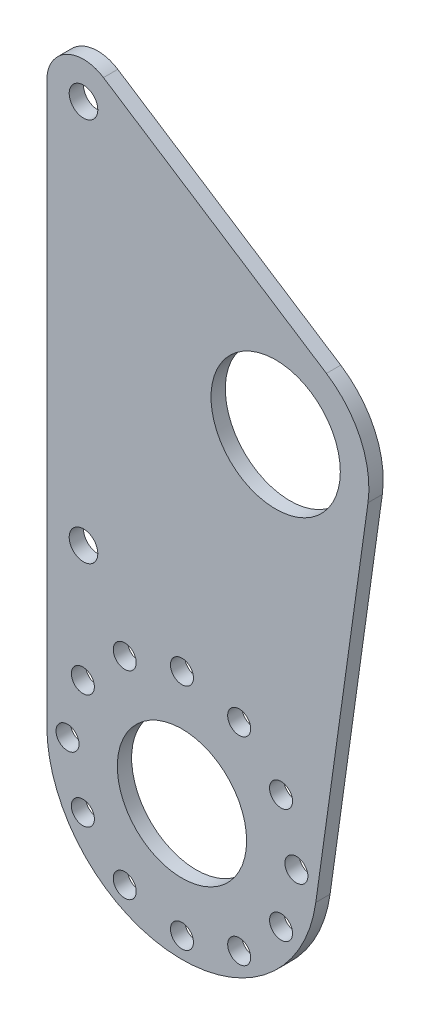
ISO-10303-21;
HEADER;
FILE_DESCRIPTION(('STEP AP214'),'2;1');
FILE_NAME('part.step','',(''),(''),'','','');
FILE_SCHEMA(('AUTOMOTIVE_DESIGN { 1 0 10303 214 1 1 1 1 }'));
ENDSEC;
DATA;
#1=APPLICATION_CONTEXT('core data for automotive mechanical design processes');
#2=APPLICATION_PROTOCOL_DEFINITION('international standard','automotive_design',2000,#1);
#3=PRODUCT_CONTEXT('',#1,'mechanical');
#4=PRODUCT('Part','Part','',(#3));
#5=PRODUCT_RELATED_PRODUCT_CATEGORY('part','',(#4));
#6=PRODUCT_DEFINITION_FORMATION('','',#4);
#7=PRODUCT_DEFINITION_CONTEXT('part definition',#1,'design');
#8=PRODUCT_DEFINITION('design','',#6,#7);
#9=PRODUCT_DEFINITION_SHAPE('','',#8);
#10=(LENGTH_UNIT() NAMED_UNIT(*) SI_UNIT(.MILLI.,.METRE.));
#11=(NAMED_UNIT(*) PLANE_ANGLE_UNIT() SI_UNIT($,.RADIAN.));
#12=(NAMED_UNIT(*) SI_UNIT($,.STERADIAN.) SOLID_ANGLE_UNIT());
#13=UNCERTAINTY_MEASURE_WITH_UNIT(LENGTH_MEASURE(1.E-05),#10,'distance_accuracy_value','');
#14=(GEOMETRIC_REPRESENTATION_CONTEXT(3) GLOBAL_UNCERTAINTY_ASSIGNED_CONTEXT((#13)) GLOBAL_UNIT_ASSIGNED_CONTEXT((#10,
#11,#12)) REPRESENTATION_CONTEXT('',''));
#15=CARTESIAN_POINT('',(0.,0.,0.));
#16=DIRECTION('',(0.,0.,1.));
#17=DIRECTION('',(1.,0.,0.));
#18=AXIS2_PLACEMENT_3D('',#15,#16,#17);
#19=CARTESIAN_POINT('',(-109.7,29.9999999999998,3.175));
#20=DIRECTION('',(0.,0.,1.));
#21=DIRECTION('',(1.,0.,0.));
#22=AXIS2_PLACEMENT_3D('',#19,#20,#21);
#23=PLANE('',#22);
#24=CARTESIAN_POINT('',(-131.556216575078,154.014440652304,3.175));
#25=DIRECTION('',(0.,0.,1.));
#26=DIRECTION('',(1.,0.,0.));
#27=AXIS2_PLACEMENT_3D('',#24,#25,#26);
#28=CIRCLE('',#27,3.17499999999997);
#29=CARTESIAN_POINT('',(-128.381216575078,154.014440652304,3.175));
#30=VERTEX_POINT('',#29);
#31=EDGE_CURVE('E243',#30,#30,#28,.T.);
#32=ORIENTED_EDGE('',*,*,#31,.F.);
#33=EDGE_LOOP('',(#32));
#34=FACE_BOUND('',#33,.T.);
#35=CARTESIAN_POINT('',(-122.4,51.9970452561247,3.175));
#36=DIRECTION('',(0.,0.,1.));
#37=DIRECTION('',(1.,0.,0.));
#38=AXIS2_PLACEMENT_3D('',#35,#36,#37);
#39=CIRCLE('',#38,2.55270000000001);
#40=CARTESIAN_POINT('',(-119.8473,51.9970452561247,3.175));
#41=VERTEX_POINT('',#40);
#42=EDGE_CURVE('E255',#41,#41,#39,.T.);
#43=ORIENTED_EDGE('',*,*,#42,.F.);
#44=EDGE_LOOP('',(#43));
#45=FACE_BOUND('',#44,.T.);
#46=CARTESIAN_POINT('',(-135.1,30.,3.175));
#47=DIRECTION('',(0.,0.,1.));
#48=DIRECTION('',(1.,0.,0.));
#49=AXIS2_PLACEMENT_3D('',#46,#47,#48);
#50=CIRCLE('',#49,2.55270000000001);
#51=CARTESIAN_POINT('',(-132.5473,30.,3.175));
#52=VERTEX_POINT('',#51);
#53=EDGE_CURVE('E267',#52,#52,#50,.T.);
#54=ORIENTED_EDGE('',*,*,#53,.F.);
#55=EDGE_LOOP('',(#54));
#56=FACE_BOUND('',#55,.T.);
#57=CARTESIAN_POINT('',(-122.4,8.00295474387526,3.175));
#58=DIRECTION('',(0.,0.,1.));
#59=DIRECTION('',(1.,0.,0.));
#60=AXIS2_PLACEMENT_3D('',#57,#58,#59);
#61=CIRCLE('',#60,2.55270000000003);
#62=CARTESIAN_POINT('',(-119.8473,8.00295474387526,3.175));
#63=VERTEX_POINT('',#62);
#64=EDGE_CURVE('E279',#63,#63,#61,.T.);
#65=ORIENTED_EDGE('',*,*,#64,.F.);
#66=EDGE_LOOP('',(#65));
#67=FACE_BOUND('',#66,.T.);
#68=CARTESIAN_POINT('',(-96.9999999999999,8.00295474387526,3.175));
#69=DIRECTION('',(0.,0.,1.));
#70=DIRECTION('',(1.,0.,0.));
#71=AXIS2_PLACEMENT_3D('',#68,#69,#70);
#72=CIRCLE('',#71,2.55270000000001);
#73=CARTESIAN_POINT('',(-94.4472999999999,8.00295474387526,3.175));
#74=VERTEX_POINT('',#73);
#75=EDGE_CURVE('E291',#74,#74,#72,.T.);
#76=ORIENTED_EDGE('',*,*,#75,.F.);
#77=EDGE_LOOP('',(#76));
#78=FACE_BOUND('',#77,.T.);
#79=CARTESIAN_POINT('',(-84.2999999999999,30.,3.175));
#80=DIRECTION('',(0.,0.,1.));
#81=DIRECTION('',(1.,0.,0.));
#82=AXIS2_PLACEMENT_3D('',#79,#80,#81);
#83=CIRCLE('',#82,2.55270000000003);
#84=CARTESIAN_POINT('',(-81.7472999999999,30.,3.175));
#85=VERTEX_POINT('',#84);
#86=EDGE_CURVE('E303',#85,#85,#83,.T.);
#87=ORIENTED_EDGE('',*,*,#86,.F.);
#88=EDGE_LOOP('',(#87));
#89=FACE_BOUND('',#88,.T.);
#90=CARTESIAN_POINT('',(-96.9999999999997,51.9970452561245,3.175));
#91=DIRECTION('',(0.,0.,1.));
#92=DIRECTION('',(1.,0.,0.));
#93=AXIS2_PLACEMENT_3D('',#90,#91,#92);
#94=CIRCLE('',#93,2.5526999999998);
#95=CARTESIAN_POINT('',(-94.4472999999999,51.9970452561245,3.175));
#96=VERTEX_POINT('',#95);
#97=EDGE_CURVE('E315',#96,#96,#94,.T.);
#98=ORIENTED_EDGE('',*,*,#97,.F.);
#99=EDGE_LOOP('',(#98));
#100=FACE_BOUND('',#99,.T.);
#101=CARTESIAN_POINT('',(-88.8999999999996,111.358224077225,3.175));
#102=DIRECTION('',(0.,0.,1.));
#103=DIRECTION('',(1.,0.,0.));
#104=AXIS2_PLACEMENT_3D('',#101,#102,#103);
#105=CIRCLE('',#104,14.3509999999997);
#106=CARTESIAN_POINT('',(-74.5489999999999,111.358224077225,3.175));
#107=VERTEX_POINT('',#106);
#108=EDGE_CURVE('E128',#107,#107,#105,.T.);
#109=ORIENTED_EDGE('',*,*,#108,.F.);
#110=EDGE_LOOP('',(#109));
#111=FACE_BOUND('',#110,.T.);
#112=CARTESIAN_POINT('',(-109.7,29.9999999999998,3.175));
#113=DIRECTION('',(0.,0.,1.));
#114=DIRECTION('',(1.,0.,0.));
#115=AXIS2_PLACEMENT_3D('',#112,#113,#114);
#116=CIRCLE('',#115,29.9999999999994);
#117=CARTESIAN_POINT('',(-139.699999999999,29.9999999999998,3.175));
#118=VERTEX_POINT('',#117);
#119=CARTESIAN_POINT('',(-79.9907435318816,25.8334570551205,3.175));
#120=VERTEX_POINT('',#119);
#121=EDGE_CURVE('E135',#118,#120,#116,.T.);
#122=ORIENTED_EDGE('',*,*,#121,.T.);
#123=DIRECTION('',(0.138884764829311,0.990308548937303,0.));
#124=VECTOR('',#123,1.);
#125=CARTESIAN_POINT('',(-79.9907435318816,25.8334570551205,3.175));
#126=LINE('',#125,#124);
#127=CARTESIAN_POINT('',(-68.3996227284498,108.483170560493,3.175));
#128=VERTEX_POINT('',#127);
#129=EDGE_CURVE('E93',#120,#128,#126,.T.);
#130=ORIENTED_EDGE('',*,*,#129,.T.);
#131=CARTESIAN_POINT('',(-88.8999999999996,111.358224077225,3.175));
#132=DIRECTION('',(0.,0.,1.));
#133=DIRECTION('',(1.,0.,0.));
#134=AXIS2_PLACEMENT_3D('',#131,#132,#133);
#135=CIRCLE('',#134,20.7009999999987);
#136=CARTESIAN_POINT('',(-77.6298246779365,128.722398379791,3.175));
#137=VERTEX_POINT('',#136);
#138=EDGE_CURVE('E106',#128,#137,#135,.T.);
#139=ORIENTED_EDGE('',*,*,#138,.T.);
#140=DIRECTION('',(-0.838808477975331,0.544426613306798,0.));
#141=VECTOR('',#140,1.);
#142=CARTESIAN_POINT('',(-77.6298246779366,128.722398379791,3.175));
#143=LINE('',#142,#141);
#144=CARTESIAN_POINT('',(-127.122524145544,160.845515231923,3.175));
#145=VERTEX_POINT('',#144);
#146=EDGE_CURVE('E100',#137,#145,#143,.T.);
#147=ORIENTED_EDGE('',*,*,#146,.T.);
#148=CARTESIAN_POINT('',(-131.556216575078,154.014440652304,3.175));
#149=DIRECTION('',(0.,0.,1.));
#150=DIRECTION('',(1.,0.,0.));
#151=AXIS2_PLACEMENT_3D('',#148,#149,#150);
#152=CIRCLE('',#151,8.14378342492192);
#153=CARTESIAN_POINT('',(-139.7,154.014440652304,3.175));
#154=VERTEX_POINT('',#153);
#155=EDGE_CURVE('E104',#145,#154,#152,.T.);
#156=ORIENTED_EDGE('',*,*,#155,.T.);
#157=DIRECTION('',(0.,-1.,0.));
#158=VECTOR('',#157,1.);
#159=CARTESIAN_POINT('',(-139.7,154.014440652304,3.175));
#160=LINE('',#159,#158);
#161=EDGE_CURVE('E56',#154,#118,#160,.T.);
#162=ORIENTED_EDGE('',*,*,#161,.T.);
#163=EDGE_LOOP('',(#122,#130,#139,#147,#156,#162));
#164=FACE_BOUND('',#163,.T.);
#165=CARTESIAN_POINT('',(-109.7,55.3999999999998,3.175));
#166=DIRECTION('',(0.,0.,1.));
#167=DIRECTION('',(1.,0.,0.));
#168=AXIS2_PLACEMENT_3D('',#165,#166,#167);
#169=CIRCLE('',#168,2.5526999999998);
#170=CARTESIAN_POINT('',(-107.1473,55.3999999999998,3.175));
#171=VERTEX_POINT('',#170);
#172=EDGE_CURVE('E321',#171,#171,#169,.T.);
#173=ORIENTED_EDGE('',*,*,#172,.F.);
#174=EDGE_LOOP('',(#173));
#175=FACE_BOUND('',#174,.T.);
#176=CARTESIAN_POINT('',(-87.7029547438749,42.6999999999998,3.175));
#177=DIRECTION('',(0.,0.,1.));
#178=DIRECTION('',(1.,0.,0.));
#179=AXIS2_PLACEMENT_3D('',#176,#177,#178);
#180=CIRCLE('',#179,2.55269999999982);
#181=CARTESIAN_POINT('',(-85.1502547438751,42.6999999999998,3.175));
#182=VERTEX_POINT('',#181);
#183=EDGE_CURVE('E309',#182,#182,#180,.T.);
#184=ORIENTED_EDGE('',*,*,#183,.F.);
#185=EDGE_LOOP('',(#184));
#186=FACE_BOUND('',#185,.T.);
#187=CARTESIAN_POINT('',(-87.7029547438752,17.3,3.175));
#188=DIRECTION('',(0.,0.,1.));
#189=DIRECTION('',(1.,0.,0.));
#190=AXIS2_PLACEMENT_3D('',#187,#188,#189);
#191=CIRCLE('',#190,2.55270000000001);
#192=CARTESIAN_POINT('',(-85.1502547438752,17.3,3.175));
#193=VERTEX_POINT('',#192);
#194=EDGE_CURVE('E297',#193,#193,#191,.T.);
#195=ORIENTED_EDGE('',*,*,#194,.F.);
#196=EDGE_LOOP('',(#195));
#197=FACE_BOUND('',#196,.T.);
#198=CARTESIAN_POINT('',(-109.7,4.6,3.175));
#199=DIRECTION('',(0.,0.,1.));
#200=DIRECTION('',(1.,0.,0.));
#201=AXIS2_PLACEMENT_3D('',#198,#199,#200);
#202=CIRCLE('',#201,2.55270000000001);
#203=CARTESIAN_POINT('',(-107.1473,4.6,3.175));
#204=VERTEX_POINT('',#203);
#205=EDGE_CURVE('E285',#204,#204,#202,.T.);
#206=ORIENTED_EDGE('',*,*,#205,.F.);
#207=EDGE_LOOP('',(#206));
#208=FACE_BOUND('',#207,.T.);
#209=CARTESIAN_POINT('',(-131.697045256125,17.3,3.175));
#210=DIRECTION('',(0.,0.,1.));
#211=DIRECTION('',(1.,0.,0.));
#212=AXIS2_PLACEMENT_3D('',#209,#210,#211);
#213=CIRCLE('',#212,2.55270000000001);
#214=CARTESIAN_POINT('',(-129.144345256125,17.3,3.175));
#215=VERTEX_POINT('',#214);
#216=EDGE_CURVE('E273',#215,#215,#213,.T.);
#217=ORIENTED_EDGE('',*,*,#216,.F.);
#218=EDGE_LOOP('',(#217));
#219=FACE_BOUND('',#218,.T.);
#220=CARTESIAN_POINT('',(-131.697045256125,42.7,3.175));
#221=DIRECTION('',(0.,0.,1.));
#222=DIRECTION('',(1.,0.,0.));
#223=AXIS2_PLACEMENT_3D('',#220,#221,#222);
#224=CIRCLE('',#223,2.55270000000001);
#225=CARTESIAN_POINT('',(-129.144345256125,42.7,3.175));
#226=VERTEX_POINT('',#225);
#227=EDGE_CURVE('E261',#226,#226,#224,.T.);
#228=ORIENTED_EDGE('',*,*,#227,.F.);
#229=EDGE_LOOP('',(#228));
#230=FACE_BOUND('',#229,.T.);
#231=CARTESIAN_POINT('',(-131.556216575078,68.7020075021469,3.175));
#232=DIRECTION('',(0.,0.,1.));
#233=DIRECTION('',(1.,0.,0.));
#234=AXIS2_PLACEMENT_3D('',#231,#232,#233);
#235=CIRCLE('',#234,3.17499999999997);
#236=CARTESIAN_POINT('',(-128.381216575078,68.7020075021469,3.175));
#237=VERTEX_POINT('',#236);
#238=EDGE_CURVE('E249',#237,#237,#235,.T.);
#239=ORIENTED_EDGE('',*,*,#238,.F.);
#240=EDGE_LOOP('',(#239));
#241=FACE_BOUND('',#240,.T.);
#242=CARTESIAN_POINT('',(-109.7,29.9999999999998,3.175));
#243=DIRECTION('',(0.,0.,1.));
#244=DIRECTION('',(1.,0.,0.));
#245=AXIS2_PLACEMENT_3D('',#242,#243,#244);
#246=CIRCLE('',#245,14.3509999999998);
#247=CARTESIAN_POINT('',(-95.3489999999999,29.9999999999998,3.175));
#248=VERTEX_POINT('',#247);
#249=EDGE_CURVE('E234',#248,#248,#246,.T.);
#250=ORIENTED_EDGE('',*,*,#249,.F.);
#251=EDGE_LOOP('',(#250));
#252=FACE_BOUND('',#251,.T.);
#253=ADVANCED_FACE('F39',(#34,#45,#56,#67,#78,#89,#100,#111,#164,#175,#186,#197,#208,#219,#230,
#241,#252),#23,.T.);
#254=CARTESIAN_POINT('',(-109.7,29.9999999999998,0.));
#255=DIRECTION('',(0.,0.,1.));
#256=DIRECTION('',(1.,0.,0.));
#257=AXIS2_PLACEMENT_3D('',#254,#255,#256);
#258=PLANE('',#257);
#259=CARTESIAN_POINT('',(-109.7,29.9999999999998,0.));
#260=DIRECTION('',(0.,0.,1.));
#261=DIRECTION('',(1.,0.,0.));
#262=AXIS2_PLACEMENT_3D('',#259,#260,#261);
#263=CIRCLE('',#262,29.9999999999994);
#264=CARTESIAN_POINT('',(-139.699999999999,29.9999999999998,0.));
#265=VERTEX_POINT('',#264);
#266=CARTESIAN_POINT('',(-79.9907435318816,25.8334570551205,0.));
#267=VERTEX_POINT('',#266);
#268=EDGE_CURVE('E124',#265,#267,#263,.T.);
#269=ORIENTED_EDGE('',*,*,#268,.F.);
#270=DIRECTION('',(0.,-1.,0.));
#271=VECTOR('',#270,1.);
#272=CARTESIAN_POINT('',(-139.7,154.014440652304,0.));
#273=LINE('',#272,#271);
#274=CARTESIAN_POINT('',(-139.7,154.014440652304,0.));
#275=VERTEX_POINT('',#274);
#276=EDGE_CURVE('E85',#275,#265,#273,.T.);
#277=ORIENTED_EDGE('',*,*,#276,.F.);
#278=CARTESIAN_POINT('',(-131.556216575078,154.014440652304,0.));
#279=DIRECTION('',(0.,0.,1.));
#280=DIRECTION('',(1.,0.,0.));
#281=AXIS2_PLACEMENT_3D('',#278,#279,#280);
#282=CIRCLE('',#281,8.14378342492192);
#283=CARTESIAN_POINT('',(-127.122524145544,160.845515231923,0.));
#284=VERTEX_POINT('',#283);
#285=EDGE_CURVE('E79',#284,#275,#282,.T.);
#286=ORIENTED_EDGE('',*,*,#285,.F.);
#287=DIRECTION('',(-0.838808477975331,0.544426613306798,0.));
#288=VECTOR('',#287,1.);
#289=CARTESIAN_POINT('',(-77.6298246779366,128.722398379791,0.));
#290=LINE('',#289,#288);
#291=CARTESIAN_POINT('',(-77.6298246779365,128.722398379791,0.));
#292=VERTEX_POINT('',#291);
#293=EDGE_CURVE('E114',#292,#284,#290,.T.);
#294=ORIENTED_EDGE('',*,*,#293,.F.);
#295=CARTESIAN_POINT('',(-88.8999999999996,111.358224077225,0.));
#296=DIRECTION('',(0.,0.,1.));
#297=DIRECTION('',(1.,0.,0.));
#298=AXIS2_PLACEMENT_3D('',#295,#296,#297);
#299=CIRCLE('',#298,20.7009999999987);
#300=CARTESIAN_POINT('',(-68.3996227284498,108.483170560493,0.));
#301=VERTEX_POINT('',#300);
#302=EDGE_CURVE('E130',#301,#292,#299,.T.);
#303=ORIENTED_EDGE('',*,*,#302,.F.);
#304=DIRECTION('',(0.138884764829311,0.990308548937303,0.));
#305=VECTOR('',#304,1.);
#306=CARTESIAN_POINT('',(-79.9907435318816,25.8334570551205,0.));
#307=LINE('',#306,#305);
#308=EDGE_CURVE('E127',#267,#301,#307,.T.);
#309=ORIENTED_EDGE('',*,*,#308,.F.);
#310=EDGE_LOOP('',(#269,#277,#286,#294,#303,#309));
#311=FACE_BOUND('',#310,.T.);
#312=CARTESIAN_POINT('',(-88.8999999999996,111.358224077225,0.));
#313=DIRECTION('',(0.,0.,1.));
#314=DIRECTION('',(1.,0.,0.));
#315=AXIS2_PLACEMENT_3D('',#312,#313,#314);
#316=CIRCLE('',#315,14.3509999999997);
#317=CARTESIAN_POINT('',(-74.5489999999999,111.358224077225,0.));
#318=VERTEX_POINT('',#317);
#319=EDGE_CURVE('E324',#318,#318,#316,.T.);
#320=ORIENTED_EDGE('',*,*,#319,.T.);
#321=EDGE_LOOP('',(#320));
#322=FACE_BOUND('',#321,.T.);
#323=CARTESIAN_POINT('',(-109.7,55.3999999999998,0.));
#324=DIRECTION('',(0.,0.,1.));
#325=DIRECTION('',(1.,0.,0.));
#326=AXIS2_PLACEMENT_3D('',#323,#324,#325);
#327=CIRCLE('',#326,2.5526999999998);
#328=CARTESIAN_POINT('',(-107.1473,55.3999999999998,0.));
#329=VERTEX_POINT('',#328);
#330=EDGE_CURVE('E318',#329,#329,#327,.T.);
#331=ORIENTED_EDGE('',*,*,#330,.T.);
#332=EDGE_LOOP('',(#331));
#333=FACE_BOUND('',#332,.T.);
#334=CARTESIAN_POINT('',(-96.9999999999997,51.9970452561245,0.));
#335=DIRECTION('',(0.,0.,1.));
#336=DIRECTION('',(1.,0.,0.));
#337=AXIS2_PLACEMENT_3D('',#334,#335,#336);
#338=CIRCLE('',#337,2.5526999999998);
#339=CARTESIAN_POINT('',(-94.4472999999999,51.9970452561245,0.));
#340=VERTEX_POINT('',#339);
#341=EDGE_CURVE('E312',#340,#340,#338,.T.);
#342=ORIENTED_EDGE('',*,*,#341,.T.);
#343=EDGE_LOOP('',(#342));
#344=FACE_BOUND('',#343,.T.);
#345=CARTESIAN_POINT('',(-87.7029547438749,42.6999999999998,0.));
#346=DIRECTION('',(0.,0.,1.));
#347=DIRECTION('',(1.,0.,0.));
#348=AXIS2_PLACEMENT_3D('',#345,#346,#347);
#349=CIRCLE('',#348,2.55269999999982);
#350=CARTESIAN_POINT('',(-85.1502547438751,42.6999999999998,0.));
#351=VERTEX_POINT('',#350);
#352=EDGE_CURVE('E306',#351,#351,#349,.T.);
#353=ORIENTED_EDGE('',*,*,#352,.T.);
#354=EDGE_LOOP('',(#353));
#355=FACE_BOUND('',#354,.T.);
#356=CARTESIAN_POINT('',(-84.2999999999999,30.,0.));
#357=DIRECTION('',(0.,0.,1.));
#358=DIRECTION('',(1.,0.,0.));
#359=AXIS2_PLACEMENT_3D('',#356,#357,#358);
#360=CIRCLE('',#359,2.55270000000003);
#361=CARTESIAN_POINT('',(-81.7472999999999,30.,0.));
#362=VERTEX_POINT('',#361);
#363=EDGE_CURVE('E300',#362,#362,#360,.T.);
#364=ORIENTED_EDGE('',*,*,#363,.T.);
#365=EDGE_LOOP('',(#364));
#366=FACE_BOUND('',#365,.T.);
#367=CARTESIAN_POINT('',(-87.7029547438752,17.3,0.));
#368=DIRECTION('',(0.,0.,1.));
#369=DIRECTION('',(1.,0.,0.));
#370=AXIS2_PLACEMENT_3D('',#367,#368,#369);
#371=CIRCLE('',#370,2.55270000000001);
#372=CARTESIAN_POINT('',(-85.1502547438752,17.3,0.));
#373=VERTEX_POINT('',#372);
#374=EDGE_CURVE('E294',#373,#373,#371,.T.);
#375=ORIENTED_EDGE('',*,*,#374,.T.);
#376=EDGE_LOOP('',(#375));
#377=FACE_BOUND('',#376,.T.);
#378=CARTESIAN_POINT('',(-96.9999999999999,8.00295474387526,0.));
#379=DIRECTION('',(0.,0.,1.));
#380=DIRECTION('',(1.,0.,0.));
#381=AXIS2_PLACEMENT_3D('',#378,#379,#380);
#382=CIRCLE('',#381,2.55270000000001);
#383=CARTESIAN_POINT('',(-94.4472999999999,8.00295474387526,0.));
#384=VERTEX_POINT('',#383);
#385=EDGE_CURVE('E288',#384,#384,#382,.T.);
#386=ORIENTED_EDGE('',*,*,#385,.T.);
#387=EDGE_LOOP('',(#386));
#388=FACE_BOUND('',#387,.T.);
#389=CARTESIAN_POINT('',(-109.7,4.6,0.));
#390=DIRECTION('',(0.,0.,1.));
#391=DIRECTION('',(1.,0.,0.));
#392=AXIS2_PLACEMENT_3D('',#389,#390,#391);
#393=CIRCLE('',#392,2.55270000000001);
#394=CARTESIAN_POINT('',(-107.1473,4.6,0.));
#395=VERTEX_POINT('',#394);
#396=EDGE_CURVE('E282',#395,#395,#393,.T.);
#397=ORIENTED_EDGE('',*,*,#396,.T.);
#398=EDGE_LOOP('',(#397));
#399=FACE_BOUND('',#398,.T.);
#400=CARTESIAN_POINT('',(-122.4,8.00295474387526,0.));
#401=DIRECTION('',(0.,0.,1.));
#402=DIRECTION('',(1.,0.,0.));
#403=AXIS2_PLACEMENT_3D('',#400,#401,#402);
#404=CIRCLE('',#403,2.55270000000003);
#405=CARTESIAN_POINT('',(-119.8473,8.00295474387526,0.));
#406=VERTEX_POINT('',#405);
#407=EDGE_CURVE('E276',#406,#406,#404,.T.);
#408=ORIENTED_EDGE('',*,*,#407,.T.);
#409=EDGE_LOOP('',(#408));
#410=FACE_BOUND('',#409,.T.);
#411=CARTESIAN_POINT('',(-131.697045256125,17.3,0.));
#412=DIRECTION('',(0.,0.,1.));
#413=DIRECTION('',(1.,0.,0.));
#414=AXIS2_PLACEMENT_3D('',#411,#412,#413);
#415=CIRCLE('',#414,2.55270000000001);
#416=CARTESIAN_POINT('',(-129.144345256125,17.3,0.));
#417=VERTEX_POINT('',#416);
#418=EDGE_CURVE('E270',#417,#417,#415,.T.);
#419=ORIENTED_EDGE('',*,*,#418,.T.);
#420=EDGE_LOOP('',(#419));
#421=FACE_BOUND('',#420,.T.);
#422=CARTESIAN_POINT('',(-135.1,30.,0.));
#423=DIRECTION('',(0.,0.,1.));
#424=DIRECTION('',(1.,0.,0.));
#425=AXIS2_PLACEMENT_3D('',#422,#423,#424);
#426=CIRCLE('',#425,2.55270000000001);
#427=CARTESIAN_POINT('',(-132.5473,30.,0.));
#428=VERTEX_POINT('',#427);
#429=EDGE_CURVE('E264',#428,#428,#426,.T.);
#430=ORIENTED_EDGE('',*,*,#429,.T.);
#431=EDGE_LOOP('',(#430));
#432=FACE_BOUND('',#431,.T.);
#433=CARTESIAN_POINT('',(-131.697045256125,42.7,0.));
#434=DIRECTION('',(0.,0.,1.));
#435=DIRECTION('',(1.,0.,0.));
#436=AXIS2_PLACEMENT_3D('',#433,#434,#435);
#437=CIRCLE('',#436,2.55270000000001);
#438=CARTESIAN_POINT('',(-129.144345256125,42.7,0.));
#439=VERTEX_POINT('',#438);
#440=EDGE_CURVE('E258',#439,#439,#437,.T.);
#441=ORIENTED_EDGE('',*,*,#440,.T.);
#442=EDGE_LOOP('',(#441));
#443=FACE_BOUND('',#442,.T.);
#444=CARTESIAN_POINT('',(-122.4,51.9970452561247,0.));
#445=DIRECTION('',(0.,0.,1.));
#446=DIRECTION('',(1.,0.,0.));
#447=AXIS2_PLACEMENT_3D('',#444,#445,#446);
#448=CIRCLE('',#447,2.55270000000001);
#449=CARTESIAN_POINT('',(-119.8473,51.9970452561247,0.));
#450=VERTEX_POINT('',#449);
#451=EDGE_CURVE('E252',#450,#450,#448,.T.);
#452=ORIENTED_EDGE('',*,*,#451,.T.);
#453=EDGE_LOOP('',(#452));
#454=FACE_BOUND('',#453,.T.);
#455=CARTESIAN_POINT('',(-131.556216575078,68.7020075021469,0.));
#456=DIRECTION('',(0.,0.,1.));
#457=DIRECTION('',(1.,0.,0.));
#458=AXIS2_PLACEMENT_3D('',#455,#456,#457);
#459=CIRCLE('',#458,3.17499999999997);
#460=CARTESIAN_POINT('',(-128.381216575078,68.7020075021469,0.));
#461=VERTEX_POINT('',#460);
#462=EDGE_CURVE('E246',#461,#461,#459,.T.);
#463=ORIENTED_EDGE('',*,*,#462,.T.);
#464=EDGE_LOOP('',(#463));
#465=FACE_BOUND('',#464,.T.);
#466=CARTESIAN_POINT('',(-131.556216575078,154.014440652304,0.));
#467=DIRECTION('',(0.,0.,1.));
#468=DIRECTION('',(1.,0.,0.));
#469=AXIS2_PLACEMENT_3D('',#466,#467,#468);
#470=CIRCLE('',#469,3.17499999999997);
#471=CARTESIAN_POINT('',(-128.381216575078,154.014440652304,0.));
#472=VERTEX_POINT('',#471);
#473=EDGE_CURVE('E240',#472,#472,#470,.T.);
#474=ORIENTED_EDGE('',*,*,#473,.T.);
#475=EDGE_LOOP('',(#474));
#476=FACE_BOUND('',#475,.T.);
#477=CARTESIAN_POINT('',(-109.7,29.9999999999998,0.));
#478=DIRECTION('',(0.,0.,1.));
#479=DIRECTION('',(1.,0.,0.));
#480=AXIS2_PLACEMENT_3D('',#477,#478,#479);
#481=CIRCLE('',#480,14.3509999999998);
#482=CARTESIAN_POINT('',(-95.3489999999999,29.9999999999998,0.));
#483=VERTEX_POINT('',#482);
#484=EDGE_CURVE('E237',#483,#483,#481,.T.);
#485=ORIENTED_EDGE('',*,*,#484,.T.);
#486=EDGE_LOOP('',(#485));
#487=FACE_BOUND('',#486,.T.);
#488=ADVANCED_FACE('F144',(#311,#322,#333,#344,#355,#366,#377,#388,#399,#410,#421,#432,#443,
#454,#465,#476,#487),#258,.F.);
#489=CARTESIAN_POINT('',(-109.7,29.9999999999998,3.175));
#490=DIRECTION('',(0.,0.,-1.));
#491=DIRECTION('',(-1.,0.,0.));
#492=AXIS2_PLACEMENT_3D('',#489,#490,#491);
#493=CYLINDRICAL_SURFACE('',#492,29.9999999999994);
#494=ORIENTED_EDGE('',*,*,#268,.T.);
#495=DIRECTION('',(0.,0.,-1.));
#496=VECTOR('',#495,1.);
#497=CARTESIAN_POINT('',(-79.9907435318816,25.8334570551205,3.175));
#498=LINE('',#497,#496);
#499=EDGE_CURVE('E11',#120,#267,#498,.T.);
#500=ORIENTED_EDGE('',*,*,#499,.F.);
#501=ORIENTED_EDGE('',*,*,#121,.F.);
#502=DIRECTION('',(0.,0.,-1.));
#503=VECTOR('',#502,1.);
#504=CARTESIAN_POINT('',(-139.699999999999,29.9999999999998,3.175));
#505=LINE('',#504,#503);
#506=EDGE_CURVE('E120',#118,#265,#505,.T.);
#507=ORIENTED_EDGE('',*,*,#506,.T.);
#508=EDGE_LOOP('',(#494,#500,#501,#507));
#509=FACE_BOUND('',#508,.T.);
#510=ADVANCED_FACE('F41',(#509),#493,.T.);
#511=CARTESIAN_POINT('',(-79.9907435318816,25.8334570551205,3.175));
#512=DIRECTION('',(-0.990308548937303,0.138884764829311,0.));
#513=DIRECTION('',(-0.138884764829311,-0.990308548937303,0.));
#514=AXIS2_PLACEMENT_3D('',#511,#512,#513);
#515=PLANE('',#514);
#516=ORIENTED_EDGE('',*,*,#308,.T.);
#517=DIRECTION('',(0.,0.,-1.));
#518=VECTOR('',#517,1.);
#519=CARTESIAN_POINT('',(-68.3996227284498,108.483170560493,3.175));
#520=LINE('',#519,#518);
#521=EDGE_CURVE('E48',#128,#301,#520,.T.);
#522=ORIENTED_EDGE('',*,*,#521,.F.);
#523=ORIENTED_EDGE('',*,*,#129,.F.);
#524=ORIENTED_EDGE('',*,*,#499,.T.);
#525=EDGE_LOOP('',(#516,#522,#523,#524));
#526=FACE_BOUND('',#525,.T.);
#527=ADVANCED_FACE('F506',(#526),#515,.F.);
#528=CARTESIAN_POINT('',(-88.8999999999996,111.358224077225,3.175));
#529=DIRECTION('',(0.,0.,-1.));
#530=DIRECTION('',(-1.,0.,0.));
#531=AXIS2_PLACEMENT_3D('',#528,#529,#530);
#532=CYLINDRICAL_SURFACE('',#531,20.7009999999987);
#533=ORIENTED_EDGE('',*,*,#302,.T.);
#534=DIRECTION('',(0.,0.,-1.));
#535=VECTOR('',#534,1.);
#536=CARTESIAN_POINT('',(-77.6298246779365,128.722398379791,3.175));
#537=LINE('',#536,#535);
#538=EDGE_CURVE('E115',#137,#292,#537,.T.);
#539=ORIENTED_EDGE('',*,*,#538,.F.);
#540=ORIENTED_EDGE('',*,*,#138,.F.);
#541=ORIENTED_EDGE('',*,*,#521,.T.);
#542=EDGE_LOOP('',(#533,#539,#540,#541));
#543=FACE_BOUND('',#542,.T.);
#544=ADVANCED_FACE('F141',(#543),#532,.T.);
#545=CARTESIAN_POINT('',(-77.6298246779366,128.722398379791,3.175));
#546=DIRECTION('',(-0.544426613306797,-0.838808477975331,0.));
#547=DIRECTION('',(0.838808477975331,-0.544426613306798,0.));
#548=AXIS2_PLACEMENT_3D('',#545,#546,#547);
#549=PLANE('',#548);
#550=ORIENTED_EDGE('',*,*,#293,.T.);
#551=DIRECTION('',(0.,0.,-1.));
#552=VECTOR('',#551,1.);
#553=CARTESIAN_POINT('',(-127.122524145544,160.845515231923,3.175));
#554=LINE('',#553,#552);
#555=EDGE_CURVE('E111',#145,#284,#554,.T.);
#556=ORIENTED_EDGE('',*,*,#555,.F.);
#557=ORIENTED_EDGE('',*,*,#146,.F.);
#558=ORIENTED_EDGE('',*,*,#538,.T.);
#559=EDGE_LOOP('',(#550,#556,#557,#558));
#560=FACE_BOUND('',#559,.T.);
#561=ADVANCED_FACE('F112',(#560),#549,.F.);
#562=CARTESIAN_POINT('',(-131.556216575078,154.014440652304,3.175));
#563=DIRECTION('',(0.,0.,-1.));
#564=DIRECTION('',(-1.,0.,0.));
#565=AXIS2_PLACEMENT_3D('',#562,#563,#564);
#566=CYLINDRICAL_SURFACE('',#565,8.14378342492192);
#567=ORIENTED_EDGE('',*,*,#285,.T.);
#568=DIRECTION('',(0.,0.,-1.));
#569=VECTOR('',#568,1.);
#570=CARTESIAN_POINT('',(-139.7,154.014440652304,3.175));
#571=LINE('',#570,#569);
#572=EDGE_CURVE('E116',#154,#275,#571,.T.);
#573=ORIENTED_EDGE('',*,*,#572,.F.);
#574=ORIENTED_EDGE('',*,*,#155,.F.);
#575=ORIENTED_EDGE('',*,*,#555,.T.);
#576=EDGE_LOOP('',(#567,#573,#574,#575));
#577=FACE_BOUND('',#576,.T.);
#578=ADVANCED_FACE('F118',(#577),#566,.T.);
#579=CARTESIAN_POINT('',(-139.7,154.014440652304,3.175));
#580=DIRECTION('',(1.,0.,0.));
#581=DIRECTION('',(0.,1.,0.));
#582=AXIS2_PLACEMENT_3D('',#579,#580,#581);
#583=PLANE('',#582);
#584=ORIENTED_EDGE('',*,*,#276,.T.);
#585=ORIENTED_EDGE('',*,*,#506,.F.);
#586=ORIENTED_EDGE('',*,*,#161,.F.);
#587=ORIENTED_EDGE('',*,*,#572,.T.);
#588=EDGE_LOOP('',(#584,#585,#586,#587));
#589=FACE_BOUND('',#588,.T.);
#590=ADVANCED_FACE('F149',(#589),#583,.F.);
#591=CARTESIAN_POINT('',(-88.8999999999996,111.358224077225,3.175));
#592=DIRECTION('',(0.,0.,-1.));
#593=DIRECTION('',(-1.,0.,0.));
#594=AXIS2_PLACEMENT_3D('',#591,#592,#593);
#595=CYLINDRICAL_SURFACE('',#594,14.3509999999997);
#596=ORIENTED_EDGE('',*,*,#108,.T.);
#597=EDGE_LOOP('',(#596));
#598=FACE_BOUND('',#597,.T.);
#599=ORIENTED_EDGE('',*,*,#319,.F.);
#600=EDGE_LOOP('',(#599));
#601=FACE_BOUND('',#600,.T.);
#602=ADVANCED_FACE('F151',(#598,#601),#595,.F.);
#603=CARTESIAN_POINT('',(-109.7,55.3999999999998,3.175));
#604=DIRECTION('',(0.,0.,-1.));
#605=DIRECTION('',(-1.,0.,0.));
#606=AXIS2_PLACEMENT_3D('',#603,#604,#605);
#607=CYLINDRICAL_SURFACE('',#606,2.5526999999998);
#608=ORIENTED_EDGE('',*,*,#172,.T.);
#609=EDGE_LOOP('',(#608));
#610=FACE_BOUND('',#609,.T.);
#611=ORIENTED_EDGE('',*,*,#330,.F.);
#612=EDGE_LOOP('',(#611));
#613=FACE_BOUND('',#612,.T.);
#614=ADVANCED_FACE('F157',(#610,#613),#607,.F.);
#615=CARTESIAN_POINT('',(-96.9999999999997,51.9970452561245,3.175));
#616=DIRECTION('',(0.,0.,-1.));
#617=DIRECTION('',(-1.,0.,0.));
#618=AXIS2_PLACEMENT_3D('',#615,#616,#617);
#619=CYLINDRICAL_SURFACE('',#618,2.5526999999998);
#620=ORIENTED_EDGE('',*,*,#97,.T.);
#621=EDGE_LOOP('',(#620));
#622=FACE_BOUND('',#621,.T.);
#623=ORIENTED_EDGE('',*,*,#341,.F.);
#624=EDGE_LOOP('',(#623));
#625=FACE_BOUND('',#624,.T.);
#626=ADVANCED_FACE('F173',(#622,#625),#619,.F.);
#627=CARTESIAN_POINT('',(-87.7029547438749,42.6999999999998,3.175));
#628=DIRECTION('',(0.,0.,-1.));
#629=DIRECTION('',(-1.,0.,0.));
#630=AXIS2_PLACEMENT_3D('',#627,#628,#629);
#631=CYLINDRICAL_SURFACE('',#630,2.55269999999982);
#632=ORIENTED_EDGE('',*,*,#183,.T.);
#633=EDGE_LOOP('',(#632));
#634=FACE_BOUND('',#633,.T.);
#635=ORIENTED_EDGE('',*,*,#352,.F.);
#636=EDGE_LOOP('',(#635));
#637=FACE_BOUND('',#636,.T.);
#638=ADVANCED_FACE('F177',(#634,#637),#631,.F.);
#639=CARTESIAN_POINT('',(-84.2999999999999,30.,3.175));
#640=DIRECTION('',(0.,0.,-1.));
#641=DIRECTION('',(-1.,0.,0.));
#642=AXIS2_PLACEMENT_3D('',#639,#640,#641);
#643=CYLINDRICAL_SURFACE('',#642,2.55270000000003);
#644=ORIENTED_EDGE('',*,*,#86,.T.);
#645=EDGE_LOOP('',(#644));
#646=FACE_BOUND('',#645,.T.);
#647=ORIENTED_EDGE('',*,*,#363,.F.);
#648=EDGE_LOOP('',(#647));
#649=FACE_BOUND('',#648,.T.);
#650=ADVANCED_FACE('F181',(#646,#649),#643,.F.);
#651=CARTESIAN_POINT('',(-87.7029547438752,17.3,3.175));
#652=DIRECTION('',(0.,0.,-1.));
#653=DIRECTION('',(-1.,0.,0.));
#654=AXIS2_PLACEMENT_3D('',#651,#652,#653);
#655=CYLINDRICAL_SURFACE('',#654,2.55270000000001);
#656=ORIENTED_EDGE('',*,*,#194,.T.);
#657=EDGE_LOOP('',(#656));
#658=FACE_BOUND('',#657,.T.);
#659=ORIENTED_EDGE('',*,*,#374,.F.);
#660=EDGE_LOOP('',(#659));
#661=FACE_BOUND('',#660,.T.);
#662=ADVANCED_FACE('F185',(#658,#661),#655,.F.);
#663=CARTESIAN_POINT('',(-96.9999999999999,8.00295474387526,3.175));
#664=DIRECTION('',(0.,0.,-1.));
#665=DIRECTION('',(-1.,0.,0.));
#666=AXIS2_PLACEMENT_3D('',#663,#664,#665);
#667=CYLINDRICAL_SURFACE('',#666,2.55270000000001);
#668=ORIENTED_EDGE('',*,*,#75,.T.);
#669=EDGE_LOOP('',(#668));
#670=FACE_BOUND('',#669,.T.);
#671=ORIENTED_EDGE('',*,*,#385,.F.);
#672=EDGE_LOOP('',(#671));
#673=FACE_BOUND('',#672,.T.);
#674=ADVANCED_FACE('F189',(#670,#673),#667,.F.);
#675=CARTESIAN_POINT('',(-109.7,4.6,3.175));
#676=DIRECTION('',(0.,0.,-1.));
#677=DIRECTION('',(-1.,0.,0.));
#678=AXIS2_PLACEMENT_3D('',#675,#676,#677);
#679=CYLINDRICAL_SURFACE('',#678,2.55270000000001);
#680=ORIENTED_EDGE('',*,*,#205,.T.);
#681=EDGE_LOOP('',(#680));
#682=FACE_BOUND('',#681,.T.);
#683=ORIENTED_EDGE('',*,*,#396,.F.);
#684=EDGE_LOOP('',(#683));
#685=FACE_BOUND('',#684,.T.);
#686=ADVANCED_FACE('F193',(#682,#685),#679,.F.);
#687=CARTESIAN_POINT('',(-122.4,8.00295474387526,3.175));
#688=DIRECTION('',(0.,0.,-1.));
#689=DIRECTION('',(-1.,0.,0.));
#690=AXIS2_PLACEMENT_3D('',#687,#688,#689);
#691=CYLINDRICAL_SURFACE('',#690,2.55270000000003);
#692=ORIENTED_EDGE('',*,*,#64,.T.);
#693=EDGE_LOOP('',(#692));
#694=FACE_BOUND('',#693,.T.);
#695=ORIENTED_EDGE('',*,*,#407,.F.);
#696=EDGE_LOOP('',(#695));
#697=FACE_BOUND('',#696,.T.);
#698=ADVANCED_FACE('F197',(#694,#697),#691,.F.);
#699=CARTESIAN_POINT('',(-131.697045256125,17.3,3.175));
#700=DIRECTION('',(0.,0.,-1.));
#701=DIRECTION('',(-1.,0.,0.));
#702=AXIS2_PLACEMENT_3D('',#699,#700,#701);
#703=CYLINDRICAL_SURFACE('',#702,2.55270000000001);
#704=ORIENTED_EDGE('',*,*,#216,.T.);
#705=EDGE_LOOP('',(#704));
#706=FACE_BOUND('',#705,.T.);
#707=ORIENTED_EDGE('',*,*,#418,.F.);
#708=EDGE_LOOP('',(#707));
#709=FACE_BOUND('',#708,.T.);
#710=ADVANCED_FACE('F201',(#706,#709),#703,.F.);
#711=CARTESIAN_POINT('',(-135.1,30.,3.175));
#712=DIRECTION('',(0.,0.,-1.));
#713=DIRECTION('',(-1.,0.,0.));
#714=AXIS2_PLACEMENT_3D('',#711,#712,#713);
#715=CYLINDRICAL_SURFACE('',#714,2.55270000000001);
#716=ORIENTED_EDGE('',*,*,#53,.T.);
#717=EDGE_LOOP('',(#716));
#718=FACE_BOUND('',#717,.T.);
#719=ORIENTED_EDGE('',*,*,#429,.F.);
#720=EDGE_LOOP('',(#719));
#721=FACE_BOUND('',#720,.T.);
#722=ADVANCED_FACE('F205',(#718,#721),#715,.F.);
#723=CARTESIAN_POINT('',(-131.697045256125,42.7,3.175));
#724=DIRECTION('',(0.,0.,-1.));
#725=DIRECTION('',(-1.,0.,0.));
#726=AXIS2_PLACEMENT_3D('',#723,#724,#725);
#727=CYLINDRICAL_SURFACE('',#726,2.55270000000001);
#728=ORIENTED_EDGE('',*,*,#227,.T.);
#729=EDGE_LOOP('',(#728));
#730=FACE_BOUND('',#729,.T.);
#731=ORIENTED_EDGE('',*,*,#440,.F.);
#732=EDGE_LOOP('',(#731));
#733=FACE_BOUND('',#732,.T.);
#734=ADVANCED_FACE('F209',(#730,#733),#727,.F.);
#735=CARTESIAN_POINT('',(-122.4,51.9970452561247,3.175));
#736=DIRECTION('',(0.,0.,-1.));
#737=DIRECTION('',(-1.,0.,0.));
#738=AXIS2_PLACEMENT_3D('',#735,#736,#737);
#739=CYLINDRICAL_SURFACE('',#738,2.55270000000001);
#740=ORIENTED_EDGE('',*,*,#42,.T.);
#741=EDGE_LOOP('',(#740));
#742=FACE_BOUND('',#741,.T.);
#743=ORIENTED_EDGE('',*,*,#451,.F.);
#744=EDGE_LOOP('',(#743));
#745=FACE_BOUND('',#744,.T.);
#746=ADVANCED_FACE('F213',(#742,#745),#739,.F.);
#747=CARTESIAN_POINT('',(-131.556216575078,68.7020075021469,3.175));
#748=DIRECTION('',(0.,0.,-1.));
#749=DIRECTION('',(-1.,0.,0.));
#750=AXIS2_PLACEMENT_3D('',#747,#748,#749);
#751=CYLINDRICAL_SURFACE('',#750,3.17499999999997);
#752=ORIENTED_EDGE('',*,*,#238,.T.);
#753=EDGE_LOOP('',(#752));
#754=FACE_BOUND('',#753,.T.);
#755=ORIENTED_EDGE('',*,*,#462,.F.);
#756=EDGE_LOOP('',(#755));
#757=FACE_BOUND('',#756,.T.);
#758=ADVANCED_FACE('F217',(#754,#757),#751,.F.);
#759=CARTESIAN_POINT('',(-131.556216575078,154.014440652304,3.175));
#760=DIRECTION('',(0.,0.,-1.));
#761=DIRECTION('',(-1.,0.,0.));
#762=AXIS2_PLACEMENT_3D('',#759,#760,#761);
#763=CYLINDRICAL_SURFACE('',#762,3.17499999999997);
#764=ORIENTED_EDGE('',*,*,#31,.T.);
#765=EDGE_LOOP('',(#764));
#766=FACE_BOUND('',#765,.T.);
#767=ORIENTED_EDGE('',*,*,#473,.F.);
#768=EDGE_LOOP('',(#767));
#769=FACE_BOUND('',#768,.T.);
#770=ADVANCED_FACE('F221',(#766,#769),#763,.F.);
#771=CARTESIAN_POINT('',(-109.7,29.9999999999998,3.175));
#772=DIRECTION('',(0.,0.,-1.));
#773=DIRECTION('',(-1.,0.,0.));
#774=AXIS2_PLACEMENT_3D('',#771,#772,#773);
#775=CYLINDRICAL_SURFACE('',#774,14.3509999999998);
#776=ORIENTED_EDGE('',*,*,#249,.T.);
#777=EDGE_LOOP('',(#776));
#778=FACE_BOUND('',#777,.T.);
#779=ORIENTED_EDGE('',*,*,#484,.F.);
#780=EDGE_LOOP('',(#779));
#781=FACE_BOUND('',#780,.T.);
#782=ADVANCED_FACE('F225',(#778,#781),#775,.F.);
#783=CLOSED_SHELL('',(#253,#488,#510,#527,#544,#561,#578,#590,#602,#614,#626,#638,#650,#662,
#674,#686,#698,#710,#722,#734,#746,#758,#770,#782));
#784=MANIFOLD_SOLID_BREP('B2',#783);
#785=ADVANCED_BREP_SHAPE_REPRESENTATION('',(#18,#784),#14);
#786=SHAPE_DEFINITION_REPRESENTATION(#9,#785);
ENDSEC;
END-ISO-10303-21;
